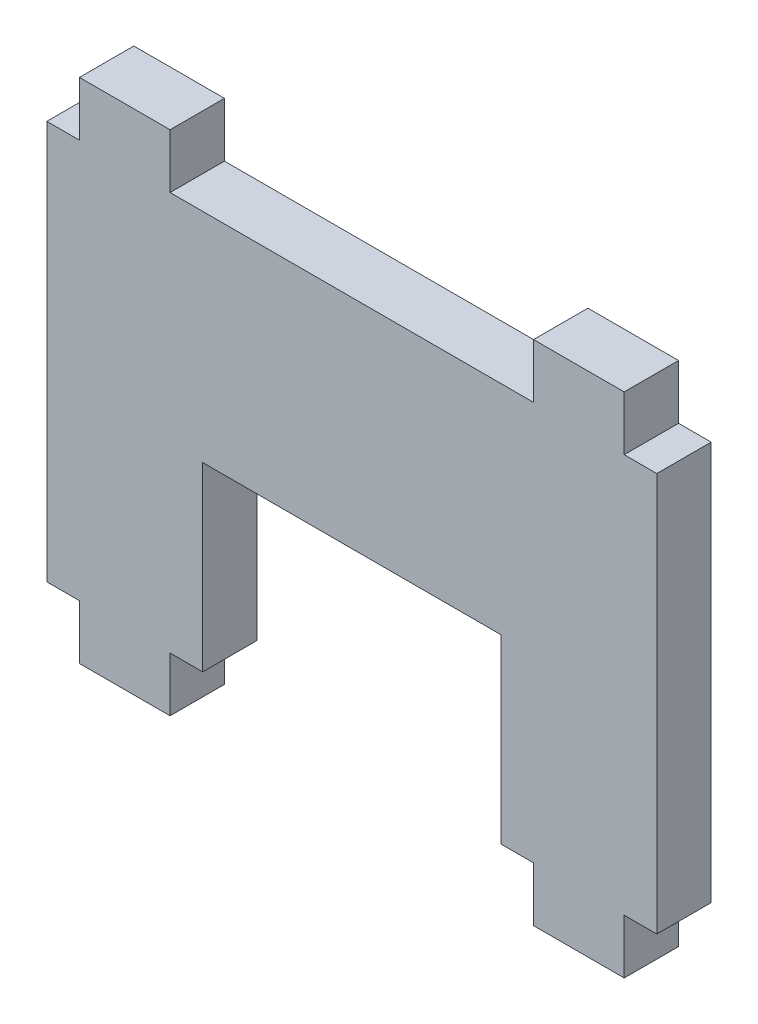
ISO-10303-21;
HEADER;
FILE_DESCRIPTION(('STEP AP214'),'2;1');
FILE_NAME('part.step','',(''),(''),'','','');
FILE_SCHEMA(('AUTOMOTIVE_DESIGN { 1 0 10303 214 1 1 1 1 }'));
ENDSEC;
DATA;
#1=APPLICATION_CONTEXT('core data for automotive mechanical design processes');
#2=APPLICATION_PROTOCOL_DEFINITION('international standard','automotive_design',2000,#1);
#3=PRODUCT_CONTEXT('',#1,'mechanical');
#4=PRODUCT('Part','Part','',(#3));
#5=PRODUCT_RELATED_PRODUCT_CATEGORY('part','',(#4));
#6=PRODUCT_DEFINITION_FORMATION('','',#4);
#7=PRODUCT_DEFINITION_CONTEXT('part definition',#1,'design');
#8=PRODUCT_DEFINITION('design','',#6,#7);
#9=PRODUCT_DEFINITION_SHAPE('','',#8);
#10=(LENGTH_UNIT() NAMED_UNIT(*) SI_UNIT(.MILLI.,.METRE.));
#11=(NAMED_UNIT(*) PLANE_ANGLE_UNIT() SI_UNIT($,.RADIAN.));
#12=(NAMED_UNIT(*) SI_UNIT($,.STERADIAN.) SOLID_ANGLE_UNIT());
#13=UNCERTAINTY_MEASURE_WITH_UNIT(LENGTH_MEASURE(1.E-05),#10,'distance_accuracy_value','');
#14=(GEOMETRIC_REPRESENTATION_CONTEXT(3) GLOBAL_UNCERTAINTY_ASSIGNED_CONTEXT((#13)) GLOBAL_UNIT_ASSIGNED_CONTEXT((#10,
#11,#12)) REPRESENTATION_CONTEXT('',''));
#15=CARTESIAN_POINT('',(0.,0.,0.));
#16=DIRECTION('',(0.,0.,1.));
#17=DIRECTION('',(1.,0.,0.));
#18=AXIS2_PLACEMENT_3D('',#15,#16,#17);
#19=CARTESIAN_POINT('',(0.,0.,3.));
#20=DIRECTION('',(1.,0.,0.));
#21=DIRECTION('',(0.,0.,-1.));
#22=AXIS2_PLACEMENT_3D('',#19,#20,#21);
#23=PLANE('',#22);
#24=DIRECTION('',(0.,-1.,0.));
#25=VECTOR('',#24,1.);
#26=CARTESIAN_POINT('',(0.,0.,0.));
#27=LINE('',#26,#25);
#28=CARTESIAN_POINT('',(0.,22.,0.));
#29=VERTEX_POINT('',#28);
#30=CARTESIAN_POINT('',(0.,0.,0.));
#31=VERTEX_POINT('',#30);
#32=EDGE_CURVE('E225',#29,#31,#27,.T.);
#33=ORIENTED_EDGE('',*,*,#32,.T.);
#34=DIRECTION('',(0.,0.,-1.));
#35=VECTOR('',#34,1.);
#36=CARTESIAN_POINT('',(0.,0.,3.));
#37=LINE('',#36,#35);
#38=CARTESIAN_POINT('',(0.,0.,3.));
#39=VERTEX_POINT('',#38);
#40=EDGE_CURVE('E11',#39,#31,#37,.T.);
#41=ORIENTED_EDGE('',*,*,#40,.F.);
#42=DIRECTION('',(0.,-1.,0.));
#43=VECTOR('',#42,1.);
#44=CARTESIAN_POINT('',(0.,0.,3.));
#45=LINE('',#44,#43);
#46=CARTESIAN_POINT('',(0.,22.,3.));
#47=VERTEX_POINT('',#46);
#48=EDGE_CURVE('E271',#47,#39,#45,.T.);
#49=ORIENTED_EDGE('',*,*,#48,.F.);
#50=DIRECTION('',(0.,0.,-1.));
#51=VECTOR('',#50,1.);
#52=CARTESIAN_POINT('',(0.,22.,3.));
#53=LINE('',#52,#51);
#54=EDGE_CURVE('E221',#47,#29,#53,.T.);
#55=ORIENTED_EDGE('',*,*,#54,.T.);
#56=EDGE_LOOP('',(#33,#41,#49,#55));
#57=FACE_BOUND('',#56,.T.);
#58=ADVANCED_FACE('F33',(#57),#23,.F.);
#59=CARTESIAN_POINT('',(0.,0.,3.));
#60=DIRECTION('',(0.,1.,0.));
#61=DIRECTION('',(0.,0.,1.));
#62=AXIS2_PLACEMENT_3D('',#59,#60,#61);
#63=PLANE('',#62);
#64=DIRECTION('',(1.,0.,0.));
#65=VECTOR('',#64,1.);
#66=CARTESIAN_POINT('',(0.,0.,0.));
#67=LINE('',#66,#65);
#68=CARTESIAN_POINT('',(1.8,0.,0.));
#69=VERTEX_POINT('',#68);
#70=EDGE_CURVE('E228',#31,#69,#67,.T.);
#71=ORIENTED_EDGE('',*,*,#70,.T.);
#72=DIRECTION('',(0.,0.,-1.));
#73=VECTOR('',#72,1.);
#74=CARTESIAN_POINT('',(1.8,0.,3.));
#75=LINE('',#74,#73);
#76=CARTESIAN_POINT('',(1.8,0.,3.));
#77=VERTEX_POINT('',#76);
#78=EDGE_CURVE('E41',#77,#69,#75,.T.);
#79=ORIENTED_EDGE('',*,*,#78,.F.);
#80=DIRECTION('',(1.,0.,0.));
#81=VECTOR('',#80,1.);
#82=CARTESIAN_POINT('',(0.,0.,3.));
#83=LINE('',#82,#81);
#84=EDGE_CURVE('E140',#39,#77,#83,.T.);
#85=ORIENTED_EDGE('',*,*,#84,.F.);
#86=ORIENTED_EDGE('',*,*,#40,.T.);
#87=EDGE_LOOP('',(#71,#79,#85,#86));
#88=FACE_BOUND('',#87,.T.);
#89=ADVANCED_FACE('F409',(#88),#63,.F.);
#90=CARTESIAN_POINT('',(1.8,0.,3.));
#91=DIRECTION('',(1.,0.,0.));
#92=DIRECTION('',(0.,1.,0.));
#93=AXIS2_PLACEMENT_3D('',#90,#91,#92);
#94=PLANE('',#93);
#95=DIRECTION('',(0.,-1.,0.));
#96=VECTOR('',#95,1.);
#97=CARTESIAN_POINT('',(1.8,0.,0.));
#98=LINE('',#97,#96);
#99=CARTESIAN_POINT('',(1.8,-3.,0.));
#100=VERTEX_POINT('',#99);
#101=EDGE_CURVE('E230',#69,#100,#98,.T.);
#102=ORIENTED_EDGE('',*,*,#101,.T.);
#103=DIRECTION('',(0.,0.,-1.));
#104=VECTOR('',#103,1.);
#105=CARTESIAN_POINT('',(1.8,-3.,3.));
#106=LINE('',#105,#104);
#107=CARTESIAN_POINT('',(1.8,-3.,3.));
#108=VERTEX_POINT('',#107);
#109=EDGE_CURVE('E326',#108,#100,#106,.T.);
#110=ORIENTED_EDGE('',*,*,#109,.F.);
#111=DIRECTION('',(0.,-1.,0.));
#112=VECTOR('',#111,1.);
#113=CARTESIAN_POINT('',(1.8,0.,3.));
#114=LINE('',#113,#112);
#115=EDGE_CURVE('E334',#77,#108,#114,.T.);
#116=ORIENTED_EDGE('',*,*,#115,.F.);
#117=ORIENTED_EDGE('',*,*,#78,.T.);
#118=EDGE_LOOP('',(#102,#110,#116,#117));
#119=FACE_BOUND('',#118,.T.);
#120=ADVANCED_FACE('F332',(#119),#94,.F.);
#121=CARTESIAN_POINT('',(1.8,-3.,3.));
#122=DIRECTION('',(0.,1.,0.));
#123=DIRECTION('',(0.,0.,1.));
#124=AXIS2_PLACEMENT_3D('',#121,#122,#123);
#125=PLANE('',#124);
#126=DIRECTION('',(1.,0.,0.));
#127=VECTOR('',#126,1.);
#128=CARTESIAN_POINT('',(1.8,-3.,0.));
#129=LINE('',#128,#127);
#130=CARTESIAN_POINT('',(6.8,-3.,0.));
#131=VERTEX_POINT('',#130);
#132=EDGE_CURVE('E232',#100,#131,#129,.T.);
#133=ORIENTED_EDGE('',*,*,#132,.T.);
#134=DIRECTION('',(0.,0.,-1.));
#135=VECTOR('',#134,1.);
#136=CARTESIAN_POINT('',(6.8,-3.,3.));
#137=LINE('',#136,#135);
#138=CARTESIAN_POINT('',(6.8,-3.,3.));
#139=VERTEX_POINT('',#138);
#140=EDGE_CURVE('E323',#139,#131,#137,.T.);
#141=ORIENTED_EDGE('',*,*,#140,.F.);
#142=DIRECTION('',(1.,0.,0.));
#143=VECTOR('',#142,1.);
#144=CARTESIAN_POINT('',(1.8,-3.,3.));
#145=LINE('',#144,#143);
#146=EDGE_CURVE('E352',#108,#139,#145,.T.);
#147=ORIENTED_EDGE('',*,*,#146,.F.);
#148=ORIENTED_EDGE('',*,*,#109,.T.);
#149=EDGE_LOOP('',(#133,#141,#147,#148));
#150=FACE_BOUND('',#149,.T.);
#151=ADVANCED_FACE('F343',(#150),#125,.F.);
#152=CARTESIAN_POINT('',(6.8,0.,3.));
#153=DIRECTION('',(-1.,0.,0.));
#154=DIRECTION('',(0.,0.,1.));
#155=AXIS2_PLACEMENT_3D('',#152,#153,#154);
#156=PLANE('',#155);
#157=DIRECTION('',(0.,1.,0.));
#158=VECTOR('',#157,1.);
#159=CARTESIAN_POINT('',(6.8,0.,0.));
#160=LINE('',#159,#158);
#161=CARTESIAN_POINT('',(6.8,0.,0.));
#162=VERTEX_POINT('',#161);
#163=EDGE_CURVE('E234',#131,#162,#160,.T.);
#164=ORIENTED_EDGE('',*,*,#163,.T.);
#165=DIRECTION('',(0.,0.,-1.));
#166=VECTOR('',#165,1.);
#167=CARTESIAN_POINT('',(6.8,0.,3.));
#168=LINE('',#167,#166);
#169=CARTESIAN_POINT('',(6.8,0.,3.));
#170=VERTEX_POINT('',#169);
#171=EDGE_CURVE('E320',#170,#162,#168,.T.);
#172=ORIENTED_EDGE('',*,*,#171,.F.);
#173=DIRECTION('',(0.,1.,0.));
#174=VECTOR('',#173,1.);
#175=CARTESIAN_POINT('',(6.8,0.,3.));
#176=LINE('',#175,#174);
#177=EDGE_CURVE('E349',#139,#170,#176,.T.);
#178=ORIENTED_EDGE('',*,*,#177,.F.);
#179=ORIENTED_EDGE('',*,*,#140,.T.);
#180=EDGE_LOOP('',(#164,#172,#178,#179));
#181=FACE_BOUND('',#180,.T.);
#182=ADVANCED_FACE('F347',(#181),#156,.F.);
#183=CARTESIAN_POINT('',(6.8,0.,3.));
#184=DIRECTION('',(0.,1.,0.));
#185=DIRECTION('',(0.,0.,1.));
#186=AXIS2_PLACEMENT_3D('',#183,#184,#185);
#187=PLANE('',#186);
#188=DIRECTION('',(1.,0.,0.));
#189=VECTOR('',#188,1.);
#190=CARTESIAN_POINT('',(6.8,0.,0.));
#191=LINE('',#190,#189);
#192=CARTESIAN_POINT('',(8.6,0.,0.));
#193=VERTEX_POINT('',#192);
#194=EDGE_CURVE('E236',#162,#193,#191,.T.);
#195=ORIENTED_EDGE('',*,*,#194,.T.);
#196=DIRECTION('',(0.,0.,-1.));
#197=VECTOR('',#196,1.);
#198=CARTESIAN_POINT('',(8.6,0.,3.));
#199=LINE('',#198,#197);
#200=CARTESIAN_POINT('',(8.6,0.,3.));
#201=VERTEX_POINT('',#200);
#202=EDGE_CURVE('E317',#201,#193,#199,.T.);
#203=ORIENTED_EDGE('',*,*,#202,.F.);
#204=DIRECTION('',(1.,0.,0.));
#205=VECTOR('',#204,1.);
#206=CARTESIAN_POINT('',(6.8,0.,3.));
#207=LINE('',#206,#205);
#208=EDGE_CURVE('E351',#170,#201,#207,.T.);
#209=ORIENTED_EDGE('',*,*,#208,.F.);
#210=ORIENTED_EDGE('',*,*,#171,.T.);
#211=EDGE_LOOP('',(#195,#203,#209,#210));
#212=FACE_BOUND('',#211,.T.);
#213=ADVANCED_FACE('F422',(#212),#187,.F.);
#214=CARTESIAN_POINT('',(8.6,10.,3.));
#215=DIRECTION('',(-1.,0.,0.));
#216=DIRECTION('',(0.,0.,1.));
#217=AXIS2_PLACEMENT_3D('',#214,#215,#216);
#218=PLANE('',#217);
#219=DIRECTION('',(0.,1.,0.));
#220=VECTOR('',#219,1.);
#221=CARTESIAN_POINT('',(8.6,10.,0.));
#222=LINE('',#221,#220);
#223=CARTESIAN_POINT('',(8.6,10.,0.));
#224=VERTEX_POINT('',#223);
#225=EDGE_CURVE('E238',#193,#224,#222,.T.);
#226=ORIENTED_EDGE('',*,*,#225,.T.);
#227=DIRECTION('',(0.,0.,-1.));
#228=VECTOR('',#227,1.);
#229=CARTESIAN_POINT('',(8.6,10.,3.));
#230=LINE('',#229,#228);
#231=CARTESIAN_POINT('',(8.6,10.,3.));
#232=VERTEX_POINT('',#231);
#233=EDGE_CURVE('E314',#232,#224,#230,.T.);
#234=ORIENTED_EDGE('',*,*,#233,.F.);
#235=DIRECTION('',(0.,1.,0.));
#236=VECTOR('',#235,1.);
#237=CARTESIAN_POINT('',(8.6,10.,3.));
#238=LINE('',#237,#236);
#239=EDGE_CURVE('E354',#201,#232,#238,.T.);
#240=ORIENTED_EDGE('',*,*,#239,.F.);
#241=ORIENTED_EDGE('',*,*,#202,.T.);
#242=EDGE_LOOP('',(#226,#234,#240,#241));
#243=FACE_BOUND('',#242,.T.);
#244=ADVANCED_FACE('F425',(#243),#218,.F.);
#245=CARTESIAN_POINT('',(8.6,10.,3.));
#246=DIRECTION('',(0.,1.,0.));
#247=DIRECTION('',(0.,0.,1.));
#248=AXIS2_PLACEMENT_3D('',#245,#246,#247);
#249=PLANE('',#248);
#250=DIRECTION('',(1.,0.,0.));
#251=VECTOR('',#250,1.);
#252=CARTESIAN_POINT('',(8.6,10.,0.));
#253=LINE('',#252,#251);
#254=CARTESIAN_POINT('',(25.05,10.,0.));
#255=VERTEX_POINT('',#254);
#256=EDGE_CURVE('E240',#224,#255,#253,.T.);
#257=ORIENTED_EDGE('',*,*,#256,.T.);
#258=DIRECTION('',(0.,0.,-1.));
#259=VECTOR('',#258,1.);
#260=CARTESIAN_POINT('',(25.05,10.,3.));
#261=LINE('',#260,#259);
#262=CARTESIAN_POINT('',(25.05,10.,3.));
#263=VERTEX_POINT('',#262);
#264=EDGE_CURVE('E311',#263,#255,#261,.T.);
#265=ORIENTED_EDGE('',*,*,#264,.F.);
#266=DIRECTION('',(1.,0.,0.));
#267=VECTOR('',#266,1.);
#268=CARTESIAN_POINT('',(8.6,10.,3.));
#269=LINE('',#268,#267);
#270=EDGE_CURVE('E360',#232,#263,#269,.T.);
#271=ORIENTED_EDGE('',*,*,#270,.F.);
#272=ORIENTED_EDGE('',*,*,#233,.T.);
#273=EDGE_LOOP('',(#257,#265,#271,#272));
#274=FACE_BOUND('',#273,.T.);
#275=ADVANCED_FACE('F429',(#274),#249,.F.);
#276=CARTESIAN_POINT('',(25.05,0.,3.));
#277=DIRECTION('',(1.,0.,0.));
#278=DIRECTION('',(0.,0.,-1.));
#279=AXIS2_PLACEMENT_3D('',#276,#277,#278);
#280=PLANE('',#279);
#281=DIRECTION('',(0.,-1.,0.));
#282=VECTOR('',#281,1.);
#283=CARTESIAN_POINT('',(25.05,0.,0.));
#284=LINE('',#283,#282);
#285=CARTESIAN_POINT('',(25.05,0.,0.));
#286=VERTEX_POINT('',#285);
#287=EDGE_CURVE('E242',#255,#286,#284,.T.);
#288=ORIENTED_EDGE('',*,*,#287,.T.);
#289=DIRECTION('',(0.,0.,-1.));
#290=VECTOR('',#289,1.);
#291=CARTESIAN_POINT('',(25.05,0.,3.));
#292=LINE('',#291,#290);
#293=CARTESIAN_POINT('',(25.05,0.,3.));
#294=VERTEX_POINT('',#293);
#295=EDGE_CURVE('E308',#294,#286,#292,.T.);
#296=ORIENTED_EDGE('',*,*,#295,.F.);
#297=DIRECTION('',(0.,-1.,0.));
#298=VECTOR('',#297,1.);
#299=CARTESIAN_POINT('',(25.05,0.,3.));
#300=LINE('',#299,#298);
#301=EDGE_CURVE('E362',#263,#294,#300,.T.);
#302=ORIENTED_EDGE('',*,*,#301,.F.);
#303=ORIENTED_EDGE('',*,*,#264,.T.);
#304=EDGE_LOOP('',(#288,#296,#302,#303));
#305=FACE_BOUND('',#304,.T.);
#306=ADVANCED_FACE('F433',(#305),#280,.F.);
#307=CARTESIAN_POINT('',(25.05,0.,3.));
#308=DIRECTION('',(0.,1.,0.));
#309=DIRECTION('',(0.,0.,1.));
#310=AXIS2_PLACEMENT_3D('',#307,#308,#309);
#311=PLANE('',#310);
#312=DIRECTION('',(1.,0.,0.));
#313=VECTOR('',#312,1.);
#314=CARTESIAN_POINT('',(25.05,0.,0.));
#315=LINE('',#314,#313);
#316=CARTESIAN_POINT('',(26.85,0.,0.));
#317=VERTEX_POINT('',#316);
#318=EDGE_CURVE('E244',#286,#317,#315,.T.);
#319=ORIENTED_EDGE('',*,*,#318,.T.);
#320=DIRECTION('',(0.,0.,-1.));
#321=VECTOR('',#320,1.);
#322=CARTESIAN_POINT('',(26.85,0.,3.));
#323=LINE('',#322,#321);
#324=CARTESIAN_POINT('',(26.85,0.,3.));
#325=VERTEX_POINT('',#324);
#326=EDGE_CURVE('E305',#325,#317,#323,.T.);
#327=ORIENTED_EDGE('',*,*,#326,.F.);
#328=DIRECTION('',(1.,0.,0.));
#329=VECTOR('',#328,1.);
#330=CARTESIAN_POINT('',(25.05,0.,3.));
#331=LINE('',#330,#329);
#332=EDGE_CURVE('E364',#294,#325,#331,.T.);
#333=ORIENTED_EDGE('',*,*,#332,.F.);
#334=ORIENTED_EDGE('',*,*,#295,.T.);
#335=EDGE_LOOP('',(#319,#327,#333,#334));
#336=FACE_BOUND('',#335,.T.);
#337=ADVANCED_FACE('F437',(#336),#311,.F.);
#338=CARTESIAN_POINT('',(26.85,0.,3.));
#339=DIRECTION('',(1.,0.,0.));
#340=DIRECTION('',(0.,0.,-1.));
#341=AXIS2_PLACEMENT_3D('',#338,#339,#340);
#342=PLANE('',#341);
#343=DIRECTION('',(0.,-1.,0.));
#344=VECTOR('',#343,1.);
#345=CARTESIAN_POINT('',(26.85,0.,0.));
#346=LINE('',#345,#344);
#347=CARTESIAN_POINT('',(26.85,-3.,0.));
#348=VERTEX_POINT('',#347);
#349=EDGE_CURVE('E246',#317,#348,#346,.T.);
#350=ORIENTED_EDGE('',*,*,#349,.T.);
#351=DIRECTION('',(0.,0.,-1.));
#352=VECTOR('',#351,1.);
#353=CARTESIAN_POINT('',(26.85,-3.,3.));
#354=LINE('',#353,#352);
#355=CARTESIAN_POINT('',(26.85,-3.,3.));
#356=VERTEX_POINT('',#355);
#357=EDGE_CURVE('E302',#356,#348,#354,.T.);
#358=ORIENTED_EDGE('',*,*,#357,.F.);
#359=DIRECTION('',(0.,-1.,0.));
#360=VECTOR('',#359,1.);
#361=CARTESIAN_POINT('',(26.85,0.,3.));
#362=LINE('',#361,#360);
#363=EDGE_CURVE('E366',#325,#356,#362,.T.);
#364=ORIENTED_EDGE('',*,*,#363,.F.);
#365=ORIENTED_EDGE('',*,*,#326,.T.);
#366=EDGE_LOOP('',(#350,#358,#364,#365));
#367=FACE_BOUND('',#366,.T.);
#368=ADVANCED_FACE('F441',(#367),#342,.F.);
#369=CARTESIAN_POINT('',(26.85,-3.,3.));
#370=DIRECTION('',(0.,1.,0.));
#371=DIRECTION('',(0.,0.,1.));
#372=AXIS2_PLACEMENT_3D('',#369,#370,#371);
#373=PLANE('',#372);
#374=DIRECTION('',(1.,0.,0.));
#375=VECTOR('',#374,1.);
#376=CARTESIAN_POINT('',(26.85,-3.,0.));
#377=LINE('',#376,#375);
#378=CARTESIAN_POINT('',(31.85,-3.,0.));
#379=VERTEX_POINT('',#378);
#380=EDGE_CURVE('E248',#348,#379,#377,.T.);
#381=ORIENTED_EDGE('',*,*,#380,.T.);
#382=DIRECTION('',(0.,0.,-1.));
#383=VECTOR('',#382,1.);
#384=CARTESIAN_POINT('',(31.85,-3.,3.));
#385=LINE('',#384,#383);
#386=CARTESIAN_POINT('',(31.85,-3.,3.));
#387=VERTEX_POINT('',#386);
#388=EDGE_CURVE('E299',#387,#379,#385,.T.);
#389=ORIENTED_EDGE('',*,*,#388,.F.);
#390=DIRECTION('',(1.,0.,0.));
#391=VECTOR('',#390,1.);
#392=CARTESIAN_POINT('',(26.85,-3.,3.));
#393=LINE('',#392,#391);
#394=EDGE_CURVE('E368',#356,#387,#393,.T.);
#395=ORIENTED_EDGE('',*,*,#394,.F.);
#396=ORIENTED_EDGE('',*,*,#357,.T.);
#397=EDGE_LOOP('',(#381,#389,#395,#396));
#398=FACE_BOUND('',#397,.T.);
#399=ADVANCED_FACE('F445',(#398),#373,.F.);
#400=CARTESIAN_POINT('',(31.85,0.,3.));
#401=DIRECTION('',(-1.,0.,0.));
#402=DIRECTION('',(0.,0.,1.));
#403=AXIS2_PLACEMENT_3D('',#400,#401,#402);
#404=PLANE('',#403);
#405=DIRECTION('',(0.,1.,0.));
#406=VECTOR('',#405,1.);
#407=CARTESIAN_POINT('',(31.85,0.,0.));
#408=LINE('',#407,#406);
#409=CARTESIAN_POINT('',(31.85,0.,0.));
#410=VERTEX_POINT('',#409);
#411=EDGE_CURVE('E250',#379,#410,#408,.T.);
#412=ORIENTED_EDGE('',*,*,#411,.T.);
#413=DIRECTION('',(0.,0.,-1.));
#414=VECTOR('',#413,1.);
#415=CARTESIAN_POINT('',(31.85,0.,3.));
#416=LINE('',#415,#414);
#417=CARTESIAN_POINT('',(31.85,0.,3.));
#418=VERTEX_POINT('',#417);
#419=EDGE_CURVE('E296',#418,#410,#416,.T.);
#420=ORIENTED_EDGE('',*,*,#419,.F.);
#421=DIRECTION('',(0.,1.,0.));
#422=VECTOR('',#421,1.);
#423=CARTESIAN_POINT('',(31.85,0.,3.));
#424=LINE('',#423,#422);
#425=EDGE_CURVE('E370',#387,#418,#424,.T.);
#426=ORIENTED_EDGE('',*,*,#425,.F.);
#427=ORIENTED_EDGE('',*,*,#388,.T.);
#428=EDGE_LOOP('',(#412,#420,#426,#427));
#429=FACE_BOUND('',#428,.T.);
#430=ADVANCED_FACE('F449',(#429),#404,.F.);
#431=CARTESIAN_POINT('',(31.85,0.,3.));
#432=DIRECTION('',(0.,1.,0.));
#433=DIRECTION('',(0.,0.,1.));
#434=AXIS2_PLACEMENT_3D('',#431,#432,#433);
#435=PLANE('',#434);
#436=DIRECTION('',(1.,0.,0.));
#437=VECTOR('',#436,1.);
#438=CARTESIAN_POINT('',(31.85,0.,0.));
#439=LINE('',#438,#437);
#440=CARTESIAN_POINT('',(33.65,0.,0.));
#441=VERTEX_POINT('',#440);
#442=EDGE_CURVE('E252',#410,#441,#439,.T.);
#443=ORIENTED_EDGE('',*,*,#442,.T.);
#444=DIRECTION('',(0.,0.,-1.));
#445=VECTOR('',#444,1.);
#446=CARTESIAN_POINT('',(33.65,0.,3.));
#447=LINE('',#446,#445);
#448=CARTESIAN_POINT('',(33.65,0.,3.));
#449=VERTEX_POINT('',#448);
#450=EDGE_CURVE('E293',#449,#441,#447,.T.);
#451=ORIENTED_EDGE('',*,*,#450,.F.);
#452=DIRECTION('',(1.,0.,0.));
#453=VECTOR('',#452,1.);
#454=CARTESIAN_POINT('',(31.85,0.,3.));
#455=LINE('',#454,#453);
#456=EDGE_CURVE('E372',#418,#449,#455,.T.);
#457=ORIENTED_EDGE('',*,*,#456,.F.);
#458=ORIENTED_EDGE('',*,*,#419,.T.);
#459=EDGE_LOOP('',(#443,#451,#457,#458));
#460=FACE_BOUND('',#459,.T.);
#461=ADVANCED_FACE('F453',(#460),#435,.F.);
#462=CARTESIAN_POINT('',(33.65,0.,3.));
#463=DIRECTION('',(-1.,0.,0.));
#464=DIRECTION('',(0.,0.,1.));
#465=AXIS2_PLACEMENT_3D('',#462,#463,#464);
#466=PLANE('',#465);
#467=DIRECTION('',(0.,1.,0.));
#468=VECTOR('',#467,1.);
#469=CARTESIAN_POINT('',(33.65,0.,0.));
#470=LINE('',#469,#468);
#471=CARTESIAN_POINT('',(33.65,22.,0.));
#472=VERTEX_POINT('',#471);
#473=EDGE_CURVE('E254',#441,#472,#470,.T.);
#474=ORIENTED_EDGE('',*,*,#473,.T.);
#475=DIRECTION('',(0.,0.,-1.));
#476=VECTOR('',#475,1.);
#477=CARTESIAN_POINT('',(33.65,22.,3.));
#478=LINE('',#477,#476);
#479=CARTESIAN_POINT('',(33.65,22.,3.));
#480=VERTEX_POINT('',#479);
#481=EDGE_CURVE('E290',#480,#472,#478,.T.);
#482=ORIENTED_EDGE('',*,*,#481,.F.);
#483=DIRECTION('',(0.,1.,0.));
#484=VECTOR('',#483,1.);
#485=CARTESIAN_POINT('',(33.65,0.,3.));
#486=LINE('',#485,#484);
#487=EDGE_CURVE('E374',#449,#480,#486,.T.);
#488=ORIENTED_EDGE('',*,*,#487,.F.);
#489=ORIENTED_EDGE('',*,*,#450,.T.);
#490=EDGE_LOOP('',(#474,#482,#488,#489));
#491=FACE_BOUND('',#490,.T.);
#492=ADVANCED_FACE('F457',(#491),#466,.F.);
#493=CARTESIAN_POINT('',(31.85,22.,3.));
#494=DIRECTION('',(0.,-1.,0.));
#495=DIRECTION('',(0.,0.,-1.));
#496=AXIS2_PLACEMENT_3D('',#493,#494,#495);
#497=PLANE('',#496);
#498=DIRECTION('',(-1.,0.,0.));
#499=VECTOR('',#498,1.);
#500=CARTESIAN_POINT('',(31.85,22.,0.));
#501=LINE('',#500,#499);
#502=CARTESIAN_POINT('',(31.85,22.,0.));
#503=VERTEX_POINT('',#502);
#504=EDGE_CURVE('E256',#472,#503,#501,.T.);
#505=ORIENTED_EDGE('',*,*,#504,.T.);
#506=DIRECTION('',(0.,0.,-1.));
#507=VECTOR('',#506,1.);
#508=CARTESIAN_POINT('',(31.85,22.,3.));
#509=LINE('',#508,#507);
#510=CARTESIAN_POINT('',(31.85,22.,3.));
#511=VERTEX_POINT('',#510);
#512=EDGE_CURVE('E287',#511,#503,#509,.T.);
#513=ORIENTED_EDGE('',*,*,#512,.F.);
#514=DIRECTION('',(-1.,0.,0.));
#515=VECTOR('',#514,1.);
#516=CARTESIAN_POINT('',(31.85,22.,3.));
#517=LINE('',#516,#515);
#518=EDGE_CURVE('E376',#480,#511,#517,.T.);
#519=ORIENTED_EDGE('',*,*,#518,.F.);
#520=ORIENTED_EDGE('',*,*,#481,.T.);
#521=EDGE_LOOP('',(#505,#513,#519,#520));
#522=FACE_BOUND('',#521,.T.);
#523=ADVANCED_FACE('F461',(#522),#497,.F.);
#524=CARTESIAN_POINT('',(31.85,22.,3.));
#525=DIRECTION('',(-1.,0.,0.));
#526=DIRECTION('',(0.,0.,1.));
#527=AXIS2_PLACEMENT_3D('',#524,#525,#526);
#528=PLANE('',#527);
#529=DIRECTION('',(0.,1.,0.));
#530=VECTOR('',#529,1.);
#531=CARTESIAN_POINT('',(31.85,22.,0.));
#532=LINE('',#531,#530);
#533=CARTESIAN_POINT('',(31.85,25.,0.));
#534=VERTEX_POINT('',#533);
#535=EDGE_CURVE('E258',#503,#534,#532,.T.);
#536=ORIENTED_EDGE('',*,*,#535,.T.);
#537=DIRECTION('',(0.,0.,-1.));
#538=VECTOR('',#537,1.);
#539=CARTESIAN_POINT('',(31.85,25.,3.));
#540=LINE('',#539,#538);
#541=CARTESIAN_POINT('',(31.85,25.,3.));
#542=VERTEX_POINT('',#541);
#543=EDGE_CURVE('E284',#542,#534,#540,.T.);
#544=ORIENTED_EDGE('',*,*,#543,.F.);
#545=DIRECTION('',(0.,1.,0.));
#546=VECTOR('',#545,1.);
#547=CARTESIAN_POINT('',(31.85,22.,3.));
#548=LINE('',#547,#546);
#549=EDGE_CURVE('E378',#511,#542,#548,.T.);
#550=ORIENTED_EDGE('',*,*,#549,.F.);
#551=ORIENTED_EDGE('',*,*,#512,.T.);
#552=EDGE_LOOP('',(#536,#544,#550,#551));
#553=FACE_BOUND('',#552,.T.);
#554=ADVANCED_FACE('F465',(#553),#528,.F.);
#555=CARTESIAN_POINT('',(26.85,25.,3.));
#556=DIRECTION('',(0.,-1.,0.));
#557=DIRECTION('',(0.,0.,-1.));
#558=AXIS2_PLACEMENT_3D('',#555,#556,#557);
#559=PLANE('',#558);
#560=DIRECTION('',(-1.,0.,0.));
#561=VECTOR('',#560,1.);
#562=CARTESIAN_POINT('',(26.85,25.,0.));
#563=LINE('',#562,#561);
#564=CARTESIAN_POINT('',(26.85,25.,0.));
#565=VERTEX_POINT('',#564);
#566=EDGE_CURVE('E260',#534,#565,#563,.T.);
#567=ORIENTED_EDGE('',*,*,#566,.T.);
#568=DIRECTION('',(0.,0.,-1.));
#569=VECTOR('',#568,1.);
#570=CARTESIAN_POINT('',(26.85,25.,3.));
#571=LINE('',#570,#569);
#572=CARTESIAN_POINT('',(26.85,25.,3.));
#573=VERTEX_POINT('',#572);
#574=EDGE_CURVE('E281',#573,#565,#571,.T.);
#575=ORIENTED_EDGE('',*,*,#574,.F.);
#576=DIRECTION('',(-1.,0.,0.));
#577=VECTOR('',#576,1.);
#578=CARTESIAN_POINT('',(26.85,25.,3.));
#579=LINE('',#578,#577);
#580=EDGE_CURVE('E380',#542,#573,#579,.T.);
#581=ORIENTED_EDGE('',*,*,#580,.F.);
#582=ORIENTED_EDGE('',*,*,#543,.T.);
#583=EDGE_LOOP('',(#567,#575,#581,#582));
#584=FACE_BOUND('',#583,.T.);
#585=ADVANCED_FACE('F469',(#584),#559,.F.);
#586=CARTESIAN_POINT('',(26.85,22.,3.));
#587=DIRECTION('',(1.,0.,0.));
#588=DIRECTION('',(0.,0.,-1.));
#589=AXIS2_PLACEMENT_3D('',#586,#587,#588);
#590=PLANE('',#589);
#591=DIRECTION('',(0.,-1.,0.));
#592=VECTOR('',#591,1.);
#593=CARTESIAN_POINT('',(26.85,22.,0.));
#594=LINE('',#593,#592);
#595=CARTESIAN_POINT('',(26.85,22.,0.));
#596=VERTEX_POINT('',#595);
#597=EDGE_CURVE('E262',#565,#596,#594,.T.);
#598=ORIENTED_EDGE('',*,*,#597,.T.);
#599=DIRECTION('',(0.,0.,-1.));
#600=VECTOR('',#599,1.);
#601=CARTESIAN_POINT('',(26.85,22.,3.));
#602=LINE('',#601,#600);
#603=CARTESIAN_POINT('',(26.85,22.,3.));
#604=VERTEX_POINT('',#603);
#605=EDGE_CURVE('E278',#604,#596,#602,.T.);
#606=ORIENTED_EDGE('',*,*,#605,.F.);
#607=DIRECTION('',(0.,-1.,0.));
#608=VECTOR('',#607,1.);
#609=CARTESIAN_POINT('',(26.85,22.,3.));
#610=LINE('',#609,#608);
#611=EDGE_CURVE('E382',#573,#604,#610,.T.);
#612=ORIENTED_EDGE('',*,*,#611,.F.);
#613=ORIENTED_EDGE('',*,*,#574,.T.);
#614=EDGE_LOOP('',(#598,#606,#612,#613));
#615=FACE_BOUND('',#614,.T.);
#616=ADVANCED_FACE('F473',(#615),#590,.F.);
#617=CARTESIAN_POINT('',(6.8,22.,3.));
#618=DIRECTION('',(0.,-1.,0.));
#619=DIRECTION('',(0.,0.,-1.));
#620=AXIS2_PLACEMENT_3D('',#617,#618,#619);
#621=PLANE('',#620);
#622=DIRECTION('',(-1.,0.,0.));
#623=VECTOR('',#622,1.);
#624=CARTESIAN_POINT('',(6.8,22.,0.));
#625=LINE('',#624,#623);
#626=CARTESIAN_POINT('',(6.8,22.,0.));
#627=VERTEX_POINT('',#626);
#628=EDGE_CURVE('E264',#596,#627,#625,.T.);
#629=ORIENTED_EDGE('',*,*,#628,.T.);
#630=DIRECTION('',(0.,0.,-1.));
#631=VECTOR('',#630,1.);
#632=CARTESIAN_POINT('',(6.8,22.,3.));
#633=LINE('',#632,#631);
#634=CARTESIAN_POINT('',(6.8,22.,3.));
#635=VERTEX_POINT('',#634);
#636=EDGE_CURVE('E275',#635,#627,#633,.T.);
#637=ORIENTED_EDGE('',*,*,#636,.F.);
#638=DIRECTION('',(-1.,0.,0.));
#639=VECTOR('',#638,1.);
#640=CARTESIAN_POINT('',(6.8,22.,3.));
#641=LINE('',#640,#639);
#642=EDGE_CURVE('E384',#604,#635,#641,.T.);
#643=ORIENTED_EDGE('',*,*,#642,.F.);
#644=ORIENTED_EDGE('',*,*,#605,.T.);
#645=EDGE_LOOP('',(#629,#637,#643,#644));
#646=FACE_BOUND('',#645,.T.);
#647=ADVANCED_FACE('F390',(#646),#621,.F.);
#648=CARTESIAN_POINT('',(6.8,22.,3.));
#649=DIRECTION('',(-1.,0.,0.));
#650=DIRECTION('',(0.,0.,1.));
#651=AXIS2_PLACEMENT_3D('',#648,#649,#650);
#652=PLANE('',#651);
#653=DIRECTION('',(0.,1.,0.));
#654=VECTOR('',#653,1.);
#655=CARTESIAN_POINT('',(6.8,22.,0.));
#656=LINE('',#655,#654);
#657=CARTESIAN_POINT('',(6.8,25.,0.));
#658=VERTEX_POINT('',#657);
#659=EDGE_CURVE('E266',#627,#658,#656,.T.);
#660=ORIENTED_EDGE('',*,*,#659,.T.);
#661=DIRECTION('',(0.,0.,-1.));
#662=VECTOR('',#661,1.);
#663=CARTESIAN_POINT('',(6.8,25.,3.));
#664=LINE('',#663,#662);
#665=CARTESIAN_POINT('',(6.8,25.,3.));
#666=VERTEX_POINT('',#665);
#667=EDGE_CURVE('E216',#666,#658,#664,.T.);
#668=ORIENTED_EDGE('',*,*,#667,.F.);
#669=DIRECTION('',(0.,1.,0.));
#670=VECTOR('',#669,1.);
#671=CARTESIAN_POINT('',(6.8,22.,3.));
#672=LINE('',#671,#670);
#673=EDGE_CURVE('E207',#635,#666,#672,.T.);
#674=ORIENTED_EDGE('',*,*,#673,.F.);
#675=ORIENTED_EDGE('',*,*,#636,.T.);
#676=EDGE_LOOP('',(#660,#668,#674,#675));
#677=FACE_BOUND('',#676,.T.);
#678=ADVANCED_FACE('F394',(#677),#652,.F.);
#679=CARTESIAN_POINT('',(1.8,25.,3.));
#680=DIRECTION('',(0.,-1.,0.));
#681=DIRECTION('',(0.,0.,-1.));
#682=AXIS2_PLACEMENT_3D('',#679,#680,#681);
#683=PLANE('',#682);
#684=DIRECTION('',(-1.,0.,0.));
#685=VECTOR('',#684,1.);
#686=CARTESIAN_POINT('',(1.8,25.,0.));
#687=LINE('',#686,#685);
#688=CARTESIAN_POINT('',(1.8,25.,0.));
#689=VERTEX_POINT('',#688);
#690=EDGE_CURVE('E215',#658,#689,#687,.T.);
#691=ORIENTED_EDGE('',*,*,#690,.T.);
#692=DIRECTION('',(0.,0.,-1.));
#693=VECTOR('',#692,1.);
#694=CARTESIAN_POINT('',(1.8,25.,3.));
#695=LINE('',#694,#693);
#696=CARTESIAN_POINT('',(1.8,25.,3.));
#697=VERTEX_POINT('',#696);
#698=EDGE_CURVE('E212',#697,#689,#695,.T.);
#699=ORIENTED_EDGE('',*,*,#698,.F.);
#700=DIRECTION('',(-1.,0.,0.));
#701=VECTOR('',#700,1.);
#702=CARTESIAN_POINT('',(1.8,25.,3.));
#703=LINE('',#702,#701);
#704=EDGE_CURVE('E201',#666,#697,#703,.T.);
#705=ORIENTED_EDGE('',*,*,#704,.F.);
#706=ORIENTED_EDGE('',*,*,#667,.T.);
#707=EDGE_LOOP('',(#691,#699,#705,#706));
#708=FACE_BOUND('',#707,.T.);
#709=ADVANCED_FACE('F213',(#708),#683,.F.);
#710=CARTESIAN_POINT('',(1.8,22.,3.));
#711=DIRECTION('',(1.,0.,0.));
#712=DIRECTION('',(0.,0.,-1.));
#713=AXIS2_PLACEMENT_3D('',#710,#711,#712);
#714=PLANE('',#713);
#715=DIRECTION('',(0.,-1.,0.));
#716=VECTOR('',#715,1.);
#717=CARTESIAN_POINT('',(1.8,22.,0.));
#718=LINE('',#717,#716);
#719=CARTESIAN_POINT('',(1.8,22.,0.));
#720=VERTEX_POINT('',#719);
#721=EDGE_CURVE('E126',#689,#720,#718,.T.);
#722=ORIENTED_EDGE('',*,*,#721,.T.);
#723=DIRECTION('',(0.,0.,-1.));
#724=VECTOR('',#723,1.);
#725=CARTESIAN_POINT('',(1.8,22.,3.));
#726=LINE('',#725,#724);
#727=CARTESIAN_POINT('',(1.8,22.,3.));
#728=VERTEX_POINT('',#727);
#729=EDGE_CURVE('E217',#728,#720,#726,.T.);
#730=ORIENTED_EDGE('',*,*,#729,.F.);
#731=DIRECTION('',(0.,-1.,0.));
#732=VECTOR('',#731,1.);
#733=CARTESIAN_POINT('',(1.8,22.,3.));
#734=LINE('',#733,#732);
#735=EDGE_CURVE('E205',#697,#728,#734,.T.);
#736=ORIENTED_EDGE('',*,*,#735,.F.);
#737=ORIENTED_EDGE('',*,*,#698,.T.);
#738=EDGE_LOOP('',(#722,#730,#736,#737));
#739=FACE_BOUND('',#738,.T.);
#740=ADVANCED_FACE('F219',(#739),#714,.F.);
#741=CARTESIAN_POINT('',(0.,22.,3.));
#742=DIRECTION('',(0.,-1.,0.));
#743=DIRECTION('',(0.,0.,-1.));
#744=AXIS2_PLACEMENT_3D('',#741,#742,#743);
#745=PLANE('',#744);
#746=DIRECTION('',(-1.,0.,0.));
#747=VECTOR('',#746,1.);
#748=CARTESIAN_POINT('',(0.,22.,0.));
#749=LINE('',#748,#747);
#750=EDGE_CURVE('E132',#720,#29,#749,.T.);
#751=ORIENTED_EDGE('',*,*,#750,.T.);
#752=ORIENTED_EDGE('',*,*,#54,.F.);
#753=DIRECTION('',(-1.,0.,0.));
#754=VECTOR('',#753,1.);
#755=CARTESIAN_POINT('',(0.,22.,3.));
#756=LINE('',#755,#754);
#757=EDGE_CURVE('E49',#728,#47,#756,.T.);
#758=ORIENTED_EDGE('',*,*,#757,.F.);
#759=ORIENTED_EDGE('',*,*,#729,.T.);
#760=EDGE_LOOP('',(#751,#752,#758,#759));
#761=FACE_BOUND('',#760,.T.);
#762=ADVANCED_FACE('F398',(#761),#745,.F.);
#763=CARTESIAN_POINT('',(0.,0.,3.));
#764=DIRECTION('',(0.,0.,-1.));
#765=DIRECTION('',(-1.,0.,0.));
#766=AXIS2_PLACEMENT_3D('',#763,#764,#765);
#767=PLANE('',#766);
#768=ORIENTED_EDGE('',*,*,#48,.T.);
#769=ORIENTED_EDGE('',*,*,#84,.T.);
#770=ORIENTED_EDGE('',*,*,#115,.T.);
#771=ORIENTED_EDGE('',*,*,#146,.T.);
#772=ORIENTED_EDGE('',*,*,#177,.T.);
#773=ORIENTED_EDGE('',*,*,#208,.T.);
#774=ORIENTED_EDGE('',*,*,#239,.T.);
#775=ORIENTED_EDGE('',*,*,#270,.T.);
#776=ORIENTED_EDGE('',*,*,#301,.T.);
#777=ORIENTED_EDGE('',*,*,#332,.T.);
#778=ORIENTED_EDGE('',*,*,#363,.T.);
#779=ORIENTED_EDGE('',*,*,#394,.T.);
#780=ORIENTED_EDGE('',*,*,#425,.T.);
#781=ORIENTED_EDGE('',*,*,#456,.T.);
#782=ORIENTED_EDGE('',*,*,#487,.T.);
#783=ORIENTED_EDGE('',*,*,#518,.T.);
#784=ORIENTED_EDGE('',*,*,#549,.T.);
#785=ORIENTED_EDGE('',*,*,#580,.T.);
#786=ORIENTED_EDGE('',*,*,#611,.T.);
#787=ORIENTED_EDGE('',*,*,#642,.T.);
#788=ORIENTED_EDGE('',*,*,#673,.T.);
#789=ORIENTED_EDGE('',*,*,#704,.T.);
#790=ORIENTED_EDGE('',*,*,#735,.T.);
#791=ORIENTED_EDGE('',*,*,#757,.T.);
#792=EDGE_LOOP('',(#768,#769,#770,#771,#772,#773,#774,#775,#776,#777,#778,#779,#780,#781,#782,
#783,#784,#785,#786,#787,#788,#789,#790,#791));
#793=FACE_BOUND('',#792,.T.);
#794=ADVANCED_FACE('F203',(#793),#767,.F.);
#795=CARTESIAN_POINT('',(0.,0.,0.));
#796=DIRECTION('',(0.,0.,-1.));
#797=DIRECTION('',(-1.,0.,0.));
#798=AXIS2_PLACEMENT_3D('',#795,#796,#797);
#799=PLANE('',#798);
#800=ORIENTED_EDGE('',*,*,#32,.F.);
#801=ORIENTED_EDGE('',*,*,#750,.F.);
#802=ORIENTED_EDGE('',*,*,#721,.F.);
#803=ORIENTED_EDGE('',*,*,#690,.F.);
#804=ORIENTED_EDGE('',*,*,#659,.F.);
#805=ORIENTED_EDGE('',*,*,#628,.F.);
#806=ORIENTED_EDGE('',*,*,#597,.F.);
#807=ORIENTED_EDGE('',*,*,#566,.F.);
#808=ORIENTED_EDGE('',*,*,#535,.F.);
#809=ORIENTED_EDGE('',*,*,#504,.F.);
#810=ORIENTED_EDGE('',*,*,#473,.F.);
#811=ORIENTED_EDGE('',*,*,#442,.F.);
#812=ORIENTED_EDGE('',*,*,#411,.F.);
#813=ORIENTED_EDGE('',*,*,#380,.F.);
#814=ORIENTED_EDGE('',*,*,#349,.F.);
#815=ORIENTED_EDGE('',*,*,#318,.F.);
#816=ORIENTED_EDGE('',*,*,#287,.F.);
#817=ORIENTED_EDGE('',*,*,#256,.F.);
#818=ORIENTED_EDGE('',*,*,#225,.F.);
#819=ORIENTED_EDGE('',*,*,#194,.F.);
#820=ORIENTED_EDGE('',*,*,#163,.F.);
#821=ORIENTED_EDGE('',*,*,#132,.F.);
#822=ORIENTED_EDGE('',*,*,#101,.F.);
#823=ORIENTED_EDGE('',*,*,#70,.F.);
#824=EDGE_LOOP('',(#800,#801,#802,#803,#804,#805,#806,#807,#808,#809,#810,#811,#812,#813,#814,
#815,#816,#817,#818,#819,#820,#821,#822,#823));
#825=FACE_BOUND('',#824,.T.);
#826=ADVANCED_FACE('F338',(#825),#799,.T.);
#827=CLOSED_SHELL('',(#58,#89,#120,#151,#182,#213,#244,#275,#306,#337,#368,#399,#430,#461,#492,
#523,#554,#585,#616,#647,#678,#709,#740,#762,#794,#826));
#828=MANIFOLD_SOLID_BREP('B2',#827);
#829=ADVANCED_BREP_SHAPE_REPRESENTATION('',(#18,#828),#14);
#830=SHAPE_DEFINITION_REPRESENTATION(#9,#829);
ENDSEC;
END-ISO-10303-21;
